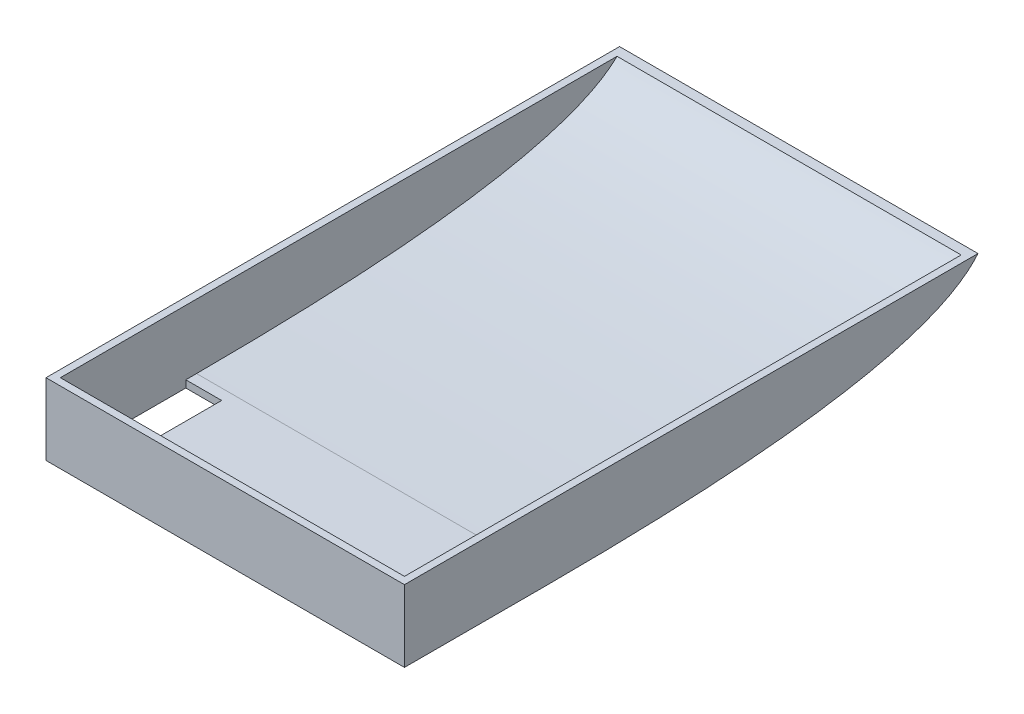
ISO-10303-21;
HEADER;
FILE_DESCRIPTION(('STEP AP214'),'2;1');
FILE_NAME('part.step','',(''),(''),'','','');
FILE_SCHEMA(('AUTOMOTIVE_DESIGN { 1 0 10303 214 1 1 1 1 }'));
ENDSEC;
DATA;
#1=APPLICATION_CONTEXT('core data for automotive mechanical design processes');
#2=APPLICATION_PROTOCOL_DEFINITION('international standard','automotive_design',2000,#1);
#3=PRODUCT_CONTEXT('',#1,'mechanical');
#4=PRODUCT('Part','Part','',(#3));
#5=PRODUCT_RELATED_PRODUCT_CATEGORY('part','',(#4));
#6=PRODUCT_DEFINITION_FORMATION('','',#4);
#7=PRODUCT_DEFINITION_CONTEXT('part definition',#1,'design');
#8=PRODUCT_DEFINITION('design','',#6,#7);
#9=PRODUCT_DEFINITION_SHAPE('','',#8);
#10=(LENGTH_UNIT() NAMED_UNIT(*) SI_UNIT(.MILLI.,.METRE.));
#11=(NAMED_UNIT(*) PLANE_ANGLE_UNIT() SI_UNIT($,.RADIAN.));
#12=(NAMED_UNIT(*) SI_UNIT($,.STERADIAN.) SOLID_ANGLE_UNIT());
#13=UNCERTAINTY_MEASURE_WITH_UNIT(LENGTH_MEASURE(1.E-05),#10,'distance_accuracy_value','');
#14=(GEOMETRIC_REPRESENTATION_CONTEXT(3) GLOBAL_UNCERTAINTY_ASSIGNED_CONTEXT((#13)) GLOBAL_UNIT_ASSIGNED_CONTEXT((#10,
#11,#12)) REPRESENTATION_CONTEXT('',''));
#15=CARTESIAN_POINT('',(0.,0.,0.));
#16=DIRECTION('',(0.,0.,1.));
#17=DIRECTION('',(1.,0.,0.));
#18=AXIS2_PLACEMENT_3D('',#15,#16,#17);
#19=CARTESIAN_POINT('',(63.5,25.4,50.8));
#20=DIRECTION('',(0.,-1.,0.));
#21=DIRECTION('',(0.,0.,-1.));
#22=AXIS2_PLACEMENT_3D('',#19,#20,#21);
#23=PLANE('',#22);
#24=DIRECTION('',(0.,0.,1.));
#25=VECTOR('',#24,1.);
#26=CARTESIAN_POINT('',(-63.5,25.4,50.8));
#27=LINE('',#26,#25);
#28=CARTESIAN_POINT('',(-63.5,25.4,-152.4));
#29=VERTEX_POINT('',#28);
#30=CARTESIAN_POINT('',(-63.5,25.4,50.8));
#31=VERTEX_POINT('',#30);
#32=EDGE_CURVE('E248',#29,#31,#27,.T.);
#33=ORIENTED_EDGE('',*,*,#32,.T.);
#34=DIRECTION('',(-1.,0.,0.));
#35=VECTOR('',#34,1.);
#36=CARTESIAN_POINT('',(63.5,25.4,50.8));
#37=LINE('',#36,#35);
#38=CARTESIAN_POINT('',(63.5,25.4,50.8));
#39=VERTEX_POINT('',#38);
#40=EDGE_CURVE('E270',#39,#31,#37,.T.);
#41=ORIENTED_EDGE('',*,*,#40,.F.);
#42=DIRECTION('',(0.,0.,1.));
#43=VECTOR('',#42,1.);
#44=CARTESIAN_POINT('',(63.5,25.4,50.8));
#45=LINE('',#44,#43);
#46=CARTESIAN_POINT('',(63.5,25.4,-152.4));
#47=VERTEX_POINT('',#46);
#48=EDGE_CURVE('E241',#47,#39,#45,.T.);
#49=ORIENTED_EDGE('',*,*,#48,.F.);
#50=DIRECTION('',(-1.,0.,0.));
#51=VECTOR('',#50,1.);
#52=CARTESIAN_POINT('',(63.5,25.4,-152.4));
#53=LINE('',#52,#51);
#54=EDGE_CURVE('E183',#47,#29,#53,.T.);
#55=ORIENTED_EDGE('',*,*,#54,.T.);
#56=EDGE_LOOP('',(#33,#41,#49,#55));
#57=FACE_BOUND('',#56,.T.);
#58=DIRECTION('',(0.,0.,1.));
#59=VECTOR('',#58,1.);
#60=CARTESIAN_POINT('',(-60.96,25.4,-105.027078163945));
#61=LINE('',#60,#59);
#62=CARTESIAN_POINT('',(-60.96,25.4,-148.966075695826));
#63=VERTEX_POINT('',#62);
#64=CARTESIAN_POINT('',(-60.96,25.4,48.26));
#65=VERTEX_POINT('',#64);
#66=EDGE_CURVE('E177',#63,#65,#61,.T.);
#67=ORIENTED_EDGE('',*,*,#66,.F.);
#68=DIRECTION('',(-1.,0.,0.));
#69=VECTOR('',#68,1.);
#70=CARTESIAN_POINT('',(60.96,25.4,-148.966075695826));
#71=LINE('',#70,#69);
#72=CARTESIAN_POINT('',(60.96,25.4,-148.966075695826));
#73=VERTEX_POINT('',#72);
#74=EDGE_CURVE('E285',#73,#63,#71,.T.);
#75=ORIENTED_EDGE('',*,*,#74,.F.);
#76=DIRECTION('',(0.,0.,1.));
#77=VECTOR('',#76,1.);
#78=CARTESIAN_POINT('',(60.96,25.4,-105.027078163945));
#79=LINE('',#78,#77);
#80=CARTESIAN_POINT('',(60.96,25.4,48.26));
#81=VERTEX_POINT('',#80);
#82=EDGE_CURVE('E286',#73,#81,#79,.T.);
#83=ORIENTED_EDGE('',*,*,#82,.T.);
#84=DIRECTION('',(-1.,0.,0.));
#85=VECTOR('',#84,1.);
#86=CARTESIAN_POINT('',(63.5,25.4,48.26));
#87=LINE('',#86,#85);
#88=EDGE_CURVE('E252',#81,#65,#87,.T.);
#89=ORIENTED_EDGE('',*,*,#88,.T.);
#90=EDGE_LOOP('',(#67,#75,#83,#89));
#91=FACE_BOUND('',#90,.T.);
#92=ADVANCED_FACE('F33',(#57,#91),#23,.F.);
#93=CARTESIAN_POINT('',(63.5,25.4,50.8));
#94=DIRECTION('',(0.,0.,-1.));
#95=DIRECTION('',(-1.,0.,0.));
#96=AXIS2_PLACEMENT_3D('',#93,#94,#95);
#97=PLANE('',#96);
#98=DIRECTION('',(0.,-1.,0.));
#99=VECTOR('',#98,1.);
#100=CARTESIAN_POINT('',(-63.5,25.4,50.8));
#101=LINE('',#100,#99);
#102=CARTESIAN_POINT('',(-63.5,0.,50.8));
#103=VERTEX_POINT('',#102);
#104=EDGE_CURVE('E251',#31,#103,#101,.T.);
#105=ORIENTED_EDGE('',*,*,#104,.T.);
#106=DIRECTION('',(-1.,0.,0.));
#107=VECTOR('',#106,1.);
#108=CARTESIAN_POINT('',(63.5,0.,50.8));
#109=LINE('',#108,#107);
#110=CARTESIAN_POINT('',(63.5,0.,50.8));
#111=VERTEX_POINT('',#110);
#112=EDGE_CURVE('E267',#111,#103,#109,.T.);
#113=ORIENTED_EDGE('',*,*,#112,.F.);
#114=DIRECTION('',(0.,-1.,0.));
#115=VECTOR('',#114,1.);
#116=CARTESIAN_POINT('',(63.5,25.4,50.8));
#117=LINE('',#116,#115);
#118=EDGE_CURVE('E244',#39,#111,#117,.T.);
#119=ORIENTED_EDGE('',*,*,#118,.F.);
#120=ORIENTED_EDGE('',*,*,#40,.T.);
#121=EDGE_LOOP('',(#105,#113,#119,#120));
#122=FACE_BOUND('',#121,.T.);
#123=ADVANCED_FACE('F326',(#122),#97,.F.);
#124=CARTESIAN_POINT('',(63.5,0.,50.8));
#125=DIRECTION('',(0.,1.,0.));
#126=DIRECTION('',(0.,0.,1.));
#127=AXIS2_PLACEMENT_3D('',#124,#125,#126);
#128=PLANE('',#127);
#129=DIRECTION('',(1.,0.,0.));
#130=VECTOR('',#129,1.);
#131=CARTESIAN_POINT('',(63.5,0.,48.26));
#132=LINE('',#131,#130);
#133=CARTESIAN_POINT('',(48.26,0.,48.26));
#134=VERTEX_POINT('',#133);
#135=CARTESIAN_POINT('',(60.96,0.,48.26));
#136=VERTEX_POINT('',#135);
#137=EDGE_CURVE('E134',#134,#136,#132,.T.);
#138=ORIENTED_EDGE('',*,*,#137,.T.);
#139=DIRECTION('',(0.,0.,-1.));
#140=VECTOR('',#139,1.);
#141=CARTESIAN_POINT('',(60.96,0.,50.8));
#142=LINE('',#141,#140);
#143=CARTESIAN_POINT('',(60.96,0.,3.81));
#144=VERTEX_POINT('',#143);
#145=EDGE_CURVE('E142',#136,#144,#142,.T.);
#146=ORIENTED_EDGE('',*,*,#145,.T.);
#147=DIRECTION('',(-1.,0.,0.));
#148=VECTOR('',#147,1.);
#149=CARTESIAN_POINT('',(63.5,0.,3.81));
#150=LINE('',#149,#148);
#151=CARTESIAN_POINT('',(48.26,0.,3.81));
#152=VERTEX_POINT('',#151);
#153=EDGE_CURVE('E129',#144,#152,#150,.T.);
#154=ORIENTED_EDGE('',*,*,#153,.T.);
#155=DIRECTION('',(0.,0.,1.));
#156=VECTOR('',#155,1.);
#157=CARTESIAN_POINT('',(48.26,0.,50.8));
#158=LINE('',#157,#156);
#159=EDGE_CURVE('E150',#152,#134,#158,.T.);
#160=ORIENTED_EDGE('',*,*,#159,.T.);
#161=EDGE_LOOP('',(#138,#146,#154,#160));
#162=FACE_BOUND('',#161,.T.);
#163=DIRECTION('',(-1.,0.,0.));
#164=VECTOR('',#163,1.);
#165=CARTESIAN_POINT('',(63.5,0.,3.81));
#166=LINE('',#165,#164);
#167=CARTESIAN_POINT('',(-48.26,0.,3.81));
#168=VERTEX_POINT('',#167);
#169=CARTESIAN_POINT('',(-60.96,0.,3.81));
#170=VERTEX_POINT('',#169);
#171=EDGE_CURVE('E168',#168,#170,#166,.T.);
#172=ORIENTED_EDGE('',*,*,#171,.T.);
#173=DIRECTION('',(0.,0.,1.));
#174=VECTOR('',#173,1.);
#175=CARTESIAN_POINT('',(-60.96,0.,50.8));
#176=LINE('',#175,#174);
#177=CARTESIAN_POINT('',(-60.96,0.,48.26));
#178=VERTEX_POINT('',#177);
#179=EDGE_CURVE('E174',#170,#178,#176,.T.);
#180=ORIENTED_EDGE('',*,*,#179,.T.);
#181=DIRECTION('',(1.,0.,0.));
#182=VECTOR('',#181,1.);
#183=CARTESIAN_POINT('',(63.5,0.,48.26));
#184=LINE('',#183,#182);
#185=CARTESIAN_POINT('',(-48.26,0.,48.26));
#186=VERTEX_POINT('',#185);
#187=EDGE_CURVE('E161',#178,#186,#184,.T.);
#188=ORIENTED_EDGE('',*,*,#187,.T.);
#189=DIRECTION('',(0.,0.,-1.));
#190=VECTOR('',#189,1.);
#191=CARTESIAN_POINT('',(-48.26,0.,50.8));
#192=LINE('',#191,#190);
#193=EDGE_CURVE('E171',#186,#168,#192,.T.);
#194=ORIENTED_EDGE('',*,*,#193,.T.);
#195=EDGE_LOOP('',(#172,#180,#188,#194));
#196=FACE_BOUND('',#195,.T.);
#197=DIRECTION('',(0.,0.,-1.));
#198=VECTOR('',#197,1.);
#199=CARTESIAN_POINT('',(-63.5,0.,50.8));
#200=LINE('',#199,#198);
#201=CARTESIAN_POINT('',(-63.5,0.,0.));
#202=VERTEX_POINT('',#201);
#203=EDGE_CURVE('E254',#103,#202,#200,.T.);
#204=ORIENTED_EDGE('',*,*,#203,.T.);
#205=DIRECTION('',(-1.,0.,0.));
#206=VECTOR('',#205,1.);
#207=CARTESIAN_POINT('',(63.5,0.,0.));
#208=LINE('',#207,#206);
#209=CARTESIAN_POINT('',(63.5,0.,0.));
#210=VERTEX_POINT('',#209);
#211=EDGE_CURVE('E264',#210,#202,#208,.T.);
#212=ORIENTED_EDGE('',*,*,#211,.F.);
#213=DIRECTION('',(0.,0.,-1.));
#214=VECTOR('',#213,1.);
#215=CARTESIAN_POINT('',(63.5,0.,50.8));
#216=LINE('',#215,#214);
#217=EDGE_CURVE('E184',#111,#210,#216,.T.);
#218=ORIENTED_EDGE('',*,*,#217,.F.);
#219=ORIENTED_EDGE('',*,*,#112,.T.);
#220=EDGE_LOOP('',(#204,#212,#218,#219));
#221=FACE_BOUND('',#220,.T.);
#222=ADVANCED_FACE('F147',(#162,#196,#221),#128,.F.);
#223=CARTESIAN_POINT('',(63.5,0.,0.));
#224=CARTESIAN_POINT('',(63.5,0.12852682136491,-90.3999097623102));
#225=CARTESIAN_POINT('',(63.5,8.8622905893951,-138.872298674878));
#226=CARTESIAN_POINT('',(63.5,25.4,-152.4));
#227=B_SPLINE_CURVE_WITH_KNOTS('',3,(#223,#224,#225,#226),.UNSPECIFIED.,.F.,.F.,(4,4),(0.,1.),.UNSPECIFIED.);
#228=DIRECTION('',(-1.,0.,0.));
#229=VECTOR('',#228,1.);
#230=SURFACE_OF_LINEAR_EXTRUSION('',#227,#229);
#231=CARTESIAN_POINT('',(-63.5,0.,0.));
#232=CARTESIAN_POINT('',(-63.5,0.12852682136491,-90.3999097623102));
#233=CARTESIAN_POINT('',(-63.5,8.8622905893951,-138.872298674878));
#234=CARTESIAN_POINT('',(-63.5,25.4,-152.4));
#235=B_SPLINE_CURVE_WITH_KNOTS('',3,(#231,#232,#233,#234),.UNSPECIFIED.,.F.,.F.,(4,4),(0.,1.),.UNSPECIFIED.);
#236=EDGE_CURVE('E245',#202,#29,#235,.T.);
#237=ORIENTED_EDGE('',*,*,#236,.T.);
#238=ORIENTED_EDGE('',*,*,#54,.F.);
#239=EDGE_CURVE('E178',#210,#47,#227,.T.);
#240=ORIENTED_EDGE('',*,*,#239,.F.);
#241=ORIENTED_EDGE('',*,*,#211,.T.);
#242=EDGE_LOOP('',(#237,#238,#240,#241));
#243=FACE_BOUND('',#242,.T.);
#244=ADVANCED_FACE('F191',(#243),#230,.F.);
#245=CARTESIAN_POINT('',(63.5,6.546556529035,-105.027078163945));
#246=DIRECTION('',(-1.,0.,0.));
#247=DIRECTION('',(0.,0.,1.));
#248=AXIS2_PLACEMENT_3D('',#245,#246,#247);
#249=PLANE('',#248);
#250=ORIENTED_EDGE('',*,*,#48,.T.);
#251=ORIENTED_EDGE('',*,*,#118,.T.);
#252=ORIENTED_EDGE('',*,*,#217,.T.);
#253=ORIENTED_EDGE('',*,*,#239,.T.);
#254=EDGE_LOOP('',(#250,#251,#252,#253));
#255=FACE_BOUND('',#254,.T.);
#256=ADVANCED_FACE('F196',(#255),#249,.F.);
#257=CARTESIAN_POINT('',(-63.5,6.546556529035,-105.027078163945));
#258=DIRECTION('',(-1.,0.,0.));
#259=DIRECTION('',(0.,0.,1.));
#260=AXIS2_PLACEMENT_3D('',#257,#258,#259);
#261=PLANE('',#260);
#262=ORIENTED_EDGE('',*,*,#32,.F.);
#263=ORIENTED_EDGE('',*,*,#236,.F.);
#264=ORIENTED_EDGE('',*,*,#203,.F.);
#265=ORIENTED_EDGE('',*,*,#104,.F.);
#266=EDGE_LOOP('',(#262,#263,#264,#265));
#267=FACE_BOUND('',#266,.T.);
#268=ADVANCED_FACE('F337',(#267),#261,.T.);
#269=CARTESIAN_POINT('',(63.5,25.4,48.26));
#270=DIRECTION('',(0.,0.,-1.));
#271=DIRECTION('',(-1.,0.,0.));
#272=AXIS2_PLACEMENT_3D('',#269,#270,#271);
#273=PLANE('',#272);
#274=DIRECTION('',(0.,-1.,0.));
#275=VECTOR('',#274,1.);
#276=CARTESIAN_POINT('',(-60.96,6.546556529035,48.26));
#277=LINE('',#276,#275);
#278=EDGE_CURVE('E185',#65,#178,#277,.T.);
#279=ORIENTED_EDGE('',*,*,#278,.F.);
#280=ORIENTED_EDGE('',*,*,#88,.F.);
#281=DIRECTION('',(0.,-1.,0.));
#282=VECTOR('',#281,1.);
#283=CARTESIAN_POINT('',(60.96,6.546556529035,48.26));
#284=LINE('',#283,#282);
#285=EDGE_CURVE('E280',#81,#136,#284,.T.);
#286=ORIENTED_EDGE('',*,*,#285,.T.);
#287=ORIENTED_EDGE('',*,*,#137,.F.);
#288=DIRECTION('',(0.,1.,0.));
#289=VECTOR('',#288,1.);
#290=CARTESIAN_POINT('',(48.26,-1.32274244273125,48.26));
#291=LINE('',#290,#289);
#292=CARTESIAN_POINT('',(48.26,2.54,48.26));
#293=VERTEX_POINT('',#292);
#294=EDGE_CURVE('E315',#134,#293,#291,.T.);
#295=ORIENTED_EDGE('',*,*,#294,.T.);
#296=DIRECTION('',(-1.,0.,0.));
#297=VECTOR('',#296,1.);
#298=CARTESIAN_POINT('',(63.5,2.54,48.26));
#299=LINE('',#298,#297);
#300=CARTESIAN_POINT('',(-48.26,2.54,48.26));
#301=VERTEX_POINT('',#300);
#302=EDGE_CURVE('E291',#293,#301,#299,.T.);
#303=ORIENTED_EDGE('',*,*,#302,.T.);
#304=DIRECTION('',(0.,1.,0.));
#305=VECTOR('',#304,1.);
#306=CARTESIAN_POINT('',(-48.26,-1.32274244273125,48.26));
#307=LINE('',#306,#305);
#308=EDGE_CURVE('E149',#186,#301,#307,.T.);
#309=ORIENTED_EDGE('',*,*,#308,.F.);
#310=ORIENTED_EDGE('',*,*,#187,.F.);
#311=EDGE_LOOP('',(#279,#280,#286,#287,#295,#303,#309,#310));
#312=FACE_BOUND('',#311,.T.);
#313=ADVANCED_FACE('F234',(#312),#273,.T.);
#314=CARTESIAN_POINT('',(63.5,2.54,50.8));
#315=DIRECTION('',(0.,1.,0.));
#316=DIRECTION('',(0.,0.,1.));
#317=AXIS2_PLACEMENT_3D('',#314,#315,#316);
#318=PLANE('',#317);
#319=DIRECTION('',(0.,0.,1.));
#320=VECTOR('',#319,1.);
#321=CARTESIAN_POINT('',(48.26,2.54,50.8));
#322=LINE('',#321,#320);
#323=CARTESIAN_POINT('',(48.26,2.54,3.81));
#324=VERTEX_POINT('',#323);
#325=EDGE_CURVE('E11',#324,#293,#322,.T.);
#326=ORIENTED_EDGE('',*,*,#325,.F.);
#327=DIRECTION('',(-1.,0.,0.));
#328=VECTOR('',#327,1.);
#329=CARTESIAN_POINT('',(63.5,2.54,3.81));
#330=LINE('',#329,#328);
#331=CARTESIAN_POINT('',(60.96,2.54,3.81000000000001));
#332=VERTEX_POINT('',#331);
#333=EDGE_CURVE('E135',#332,#324,#330,.T.);
#334=ORIENTED_EDGE('',*,*,#333,.F.);
#335=DIRECTION('',(0.,0.,-1.));
#336=VECTOR('',#335,1.);
#337=CARTESIAN_POINT('',(60.96,2.54,-105.027078163945));
#338=LINE('',#337,#336);
#339=CARTESIAN_POINT('',(60.96,2.54,0.00180644331960574));
#340=VERTEX_POINT('',#339);
#341=EDGE_CURVE('E145',#332,#340,#338,.T.);
#342=ORIENTED_EDGE('',*,*,#341,.T.);
#343=CARTESIAN_POINT('',(-60.96,2.53999743283016,0.00361126241358388));
#344=CARTESIAN_POINT('',(-55.88,2.53999743283016,0.00361126241358388));
#345=CARTESIAN_POINT('',(-50.8,2.53999743283016,0.00361126241358388));
#346=CARTESIAN_POINT('',(-40.64,2.53999743283016,0.00361126241358388));
#347=CARTESIAN_POINT('',(-35.56,2.53999743283016,0.00361126241358388));
#348=CARTESIAN_POINT('',(-25.4,2.53999743283016,0.00361126241358388));
#349=CARTESIAN_POINT('',(-20.32,2.53999743283016,0.00361126241358388));
#350=CARTESIAN_POINT('',(-10.16,2.53999743283016,0.00361126241358388));
#351=CARTESIAN_POINT('',(-5.08,2.53999743283016,0.00361126241358388));
#352=CARTESIAN_POINT('',(5.08,2.53999743283016,0.00361126241358388));
#353=CARTESIAN_POINT('',(10.16,2.53999743283016,0.00361126241358388));
#354=CARTESIAN_POINT('',(20.32,2.53999743283016,0.00361126241358388));
#355=CARTESIAN_POINT('',(25.4,2.53999743283016,0.00361126241358388));
#356=CARTESIAN_POINT('',(35.56,2.53999743283016,0.00361126241358388));
#357=CARTESIAN_POINT('',(40.64,2.53999743283016,0.00361126241358388));
#358=CARTESIAN_POINT('',(50.8,2.53999743283016,0.00361126241358388));
#359=CARTESIAN_POINT('',(55.88,2.53999743283016,0.00361126241358388));
#360=CARTESIAN_POINT('',(60.96,2.53999743283016,0.00361126241358388));
#361=B_SPLINE_CURVE_WITH_KNOTS('',3,(#343,#344,#345,#346,#347,#348,#349,#350,#351,#352,#353,
#354,#355,#356,#357,#358,#359,#360),.UNSPECIFIED.,.F.,.F.,(4,2,2,2,2,2,2,2,4),(0.,15.24,30.48,
45.72,60.96,76.2,91.44,106.68,121.92),.UNSPECIFIED.);
#362=CARTESIAN_POINT('',(-60.96,2.54,0.00180644331960574));
#363=VERTEX_POINT('',#362);
#364=EDGE_CURVE('E293',#340,#363,#361,.F.);
#365=ORIENTED_EDGE('',*,*,#364,.T.);
#366=DIRECTION('',(0.,0.,-1.));
#367=VECTOR('',#366,1.);
#368=CARTESIAN_POINT('',(-60.96,2.54,-105.027078163945));
#369=LINE('',#368,#367);
#370=CARTESIAN_POINT('',(-60.96,2.54,3.81));
#371=VERTEX_POINT('',#370);
#372=EDGE_CURVE('E273',#371,#363,#369,.T.);
#373=ORIENTED_EDGE('',*,*,#372,.F.);
#374=DIRECTION('',(-1.,0.,0.));
#375=VECTOR('',#374,1.);
#376=CARTESIAN_POINT('',(63.5,2.54,3.81));
#377=LINE('',#376,#375);
#378=CARTESIAN_POINT('',(-48.26,2.54,3.81));
#379=VERTEX_POINT('',#378);
#380=EDGE_CURVE('E166',#379,#371,#377,.T.);
#381=ORIENTED_EDGE('',*,*,#380,.F.);
#382=DIRECTION('',(0.,0.,-1.));
#383=VECTOR('',#382,1.);
#384=CARTESIAN_POINT('',(-48.26,2.54,50.8));
#385=LINE('',#384,#383);
#386=EDGE_CURVE('E40',#301,#379,#385,.T.);
#387=ORIENTED_EDGE('',*,*,#386,.F.);
#388=ORIENTED_EDGE('',*,*,#302,.F.);
#389=EDGE_LOOP('',(#326,#334,#342,#365,#373,#381,#387,#388));
#390=FACE_BOUND('',#389,.T.);
#391=ADVANCED_FACE('F204',(#390),#318,.T.);
#392=CARTESIAN_POINT('',(63.5,0.,0.));
#393=CARTESIAN_POINT('',(63.5,0.12852682136491,-90.3999097623102));
#394=CARTESIAN_POINT('',(63.5,8.8622905893951,-138.872298674878));
#395=CARTESIAN_POINT('',(63.5,25.4,-152.4));
#396=B_SPLINE_CURVE_WITH_KNOTS('',3,(#392,#393,#394,#395),.UNSPECIFIED.,.F.,.F.,(4,4),(0.,1.),.UNSPECIFIED.);
#397=DIRECTION('',(-1.,0.,0.));
#398=VECTOR('',#397,1.);
#399=SURFACE_OF_LINEAR_EXTRUSION('',#396,#398);
#400=OFFSET_SURFACE('',#399,2.54,.F.);
#401=CARTESIAN_POINT('',(-60.96,2.54,0.00180644331960574));
#402=CARTESIAN_POINT('',(-60.96,2.54296159949105,-2.07123882373989));
#403=CARTESIAN_POINT('',(-60.96,2.5504656227912,-4.14428086822597));
#404=CARTESIAN_POINT('',(-60.96,2.57520699127266,-8.29095142177547));
#405=CARTESIAN_POINT('',(-60.96,2.59244736425697,-10.3645799126167));
#406=CARTESIAN_POINT('',(-60.96,2.63731404707515,-14.5122050272702));
#407=CARTESIAN_POINT('',(-60.96,2.66494275457469,-16.5862016255024));
#408=CARTESIAN_POINT('',(-60.96,2.73132893822943,-20.7343410385875));
#409=CARTESIAN_POINT('',(-60.96,2.77008814666917,-22.8084838259182));
#410=CARTESIAN_POINT('',(-60.96,2.85955862977798,-26.9566930534272));
#411=CARTESIAN_POINT('',(-60.96,2.91027093949728,-29.0307594714279));
#412=CARTESIAN_POINT('',(-60.96,3.02457226341336,-33.1785917306156));
#413=CARTESIAN_POINT('',(-60.96,3.08816160157526,-35.2523575629265));
#414=CARTESIAN_POINT('',(-60.96,3.22906590748395,-39.3936573069112));
#415=CARTESIAN_POINT('',(-60.96,3.30634225175279,-41.4611925259151));
#416=CARTESIAN_POINT('',(-60.96,3.47591453691312,-45.5955443898263));
#417=CARTESIAN_POINT('',(-60.96,3.56820971145094,-47.6623610660083));
#418=CARTESIAN_POINT('',(-60.96,3.76916512221427,-51.7950531948383));
#419=CARTESIAN_POINT('',(-60.96,3.87782417888787,-53.8609287045712));
#420=CARTESIAN_POINT('',(-60.96,4.11305901793069,-57.99150474508));
#421=CARTESIAN_POINT('',(-60.96,4.23963341841402,-60.0562053541599));
#422=CARTESIAN_POINT('',(-60.96,4.51250576217388,-64.1841823096239));
#423=CARTESIAN_POINT('',(-60.96,4.65880250737594,-66.2474587348765));
#424=CARTESIAN_POINT('',(-60.96,4.97324068859085,-70.3723261736285));
#425=CARTESIAN_POINT('',(-60.96,5.14138179112592,-72.4339172123736));
#426=CARTESIAN_POINT('',(-60.96,5.45961165274293,-76.0702464573845));
#427=CARTESIAN_POINT('',(-60.96,5.60464243137306,-77.6454275339102));
#428=CARTESIAN_POINT('',(-60.96,5.91028111493583,-80.7942893081196));
#429=CARTESIAN_POINT('',(-60.96,6.07088907514622,-82.3679700004589));
#430=CARTESIAN_POINT('',(-60.96,6.40921561441031,-85.5135974410036));
#431=CARTESIAN_POINT('',(-60.96,6.58693527504796,-87.0855440732436));
#432=CARTESIAN_POINT('',(-60.96,6.96125632651177,-90.2271895013959));
#433=CARTESIAN_POINT('',(-60.96,7.15785764414895,-91.7968883059973));
#434=CARTESIAN_POINT('',(-60.96,7.57277946241516,-94.9391373552935));
#435=CARTESIAN_POINT('',(-60.96,7.79117515492551,-96.5116777080353));
#436=CARTESIAN_POINT('',(-60.96,8.25162017458668,-99.6533319362776));
#437=CARTESIAN_POINT('',(-60.96,8.49366986260122,-101.22244575913));
#438=CARTESIAN_POINT('',(-60.96,9.00444553941206,-104.356245032354));
#439=CARTESIAN_POINT('',(-60.96,9.27316995009256,-105.920930739073));
#440=CARTESIAN_POINT('',(-60.96,9.84099788072674,-109.04474883871));
#441=CARTESIAN_POINT('',(-60.96,10.1400999197198,-110.603881498516));
#442=CARTESIAN_POINT('',(-60.96,10.6148985096487,-112.936657134971));
#443=CARTESIAN_POINT('',(-60.96,10.7774594428824,-113.712985001757));
#444=CARTESIAN_POINT('',(-60.96,11.1120222572797,-115.26360823273));
#445=CARTESIAN_POINT('',(-60.96,11.2840241214188,-116.037903600579));
#446=CARTESIAN_POINT('',(-60.96,11.6382281721756,-117.584126234269));
#447=CARTESIAN_POINT('',(-60.96,11.8204299243408,-118.356053599498));
#448=CARTESIAN_POINT('',(-60.96,12.1959092484627,-119.897182050894));
#449=CARTESIAN_POINT('',(-60.96,12.3891863738777,-120.66638324565));
#450=CARTESIAN_POINT('',(-60.96,12.7878248399464,-122.201669160383));
#451=CARTESIAN_POINT('',(-60.96,12.9931864008888,-122.967753823275));
#452=CARTESIAN_POINT('',(-60.96,13.415559334188,-124.490574539077));
#453=CARTESIAN_POINT('',(-60.96,13.6324726344681,-125.247337735917));
#454=CARTESIAN_POINT('',(-60.96,14.080632289911,-126.756646166046));
#455=CARTESIAN_POINT('',(-60.96,14.3118791336611,-127.509191254598));
#456=CARTESIAN_POINT('',(-60.96,14.7902162240528,-129.009290141407));
#457=CARTESIAN_POINT('',(-60.96,15.0373073619954,-129.756843656254));
#458=CARTESIAN_POINT('',(-60.96,15.5491372884443,-131.24608572261));
#459=CARTESIAN_POINT('',(-60.96,15.813879994145,-131.987772931158));
#460=CARTESIAN_POINT('',(-60.96,16.3632030239682,-133.464302903546));
#461=CARTESIAN_POINT('',(-60.96,16.6477950505067,-134.199141335233));
#462=CARTESIAN_POINT('',(-60.96,17.1482255680172,-135.435269485734));
#463=CARTESIAN_POINT('',(-60.96,17.3582977350831,-135.93889581005));
#464=CARTESIAN_POINT('',(-60.96,17.7900294836349,-136.941152232485));
#465=CARTESIAN_POINT('',(-60.96,18.0116887048341,-137.439782485378));
#466=CARTESIAN_POINT('',(-60.96,18.4675409397188,-138.430929177427));
#467=CARTESIAN_POINT('',(-60.96,18.7017263271212,-138.923449116658));
#468=CARTESIAN_POINT('',(-60.96,19.1837458086147,-139.901184436573));
#469=CARTESIAN_POINT('',(-60.96,19.4315663448378,-140.386406483481));
#470=CARTESIAN_POINT('',(-60.96,19.9421787850147,-141.348254483612));
#471=CARTESIAN_POINT('',(-60.96,20.2049541280502,-141.824889204657));
#472=CARTESIAN_POINT('',(-60.96,20.7512873016356,-142.775478035945));
#473=CARTESIAN_POINT('',(-60.96,21.0350938489522,-143.249289748635));
#474=CARTESIAN_POINT('',(-60.96,21.6218860936338,-144.18497737232));
#475=CARTESIAN_POINT('',(-60.96,21.9248734717742,-144.646852232306));
#476=CARTESIAN_POINT('',(-60.96,22.5525275518085,-145.556613216821));
#477=CARTESIAN_POINT('',(-60.96,22.8772214541115,-146.004480717283));
#478=CARTESIAN_POINT('',(-60.96,23.3825165460705,-146.663441933554));
#479=CARTESIAN_POINT('',(-60.96,23.554304440917,-146.881322269135));
#480=CARTESIAN_POINT('',(-60.96,23.9041286113822,-147.312001695411));
#481=CARTESIAN_POINT('',(-60.96,24.0821645540741,-147.524801055832));
#482=CARTESIAN_POINT('',(-60.96,24.4460239682666,-147.946164878619));
#483=CARTESIAN_POINT('',(-60.96,24.6318919523061,-148.154690982494));
#484=CARTESIAN_POINT('',(-60.96,25.0106265228138,-148.565357927499));
#485=CARTESIAN_POINT('',(-60.96,25.2034944748256,-148.767497508213));
#486=CARTESIAN_POINT('',(-60.96,25.4,-148.966075695826));
#487=B_SPLINE_CURVE_WITH_KNOTS('',3,(#401,#402,#403,#404,#405,#406,#407,#408,#409,#410,#411,
#412,#413,#414,#415,#416,#417,#418,#419,#420,#421,#422,#423,#424,#425,#426,#427,#428,#429,#430,
#431,#432,#433,#434,#435,#436,#437,#438,#439,#440,#441,#442,#443,#444,#445,#446,#447,#448,#449,
#450,#451,#452,#453,#454,#455,#456,#457,#458,#459,#460,#461,#462,#463,#464,#465,#466,#467,#468,
#469,#470,#471,#472,#473,#474,#475,#476,#477,#478,#479,#480,#481,#482,#483,#484,#485,#486),
.UNSPECIFIED.,.F.,.F.,(4,2,2,2,2,2,2,2,2,2,2,2,2,2,2,2,2,2,2,2,2,2,2,2,2,2,2,2,2,2,2,2,2,2,2,2,
2,2,2,2,2,2,4),(0.,6.21914199851044,12.4402190871462,18.6627329054322,24.8862156838635,
31.1102375680172,37.3344160579135,43.5413024793427,49.7478722862771,55.9539949211929,
62.1596391123545,68.3649064985954,74.5700791658376,79.3155424071164,84.0610224889299,
88.8068027167542,93.5525645497517,98.3153061464414,103.078120414534,107.840653075282,
112.602953665878,114.982401378112,117.361844799678,119.741186948604,122.120433233546,
124.499722903478,126.86130580811,129.22296925632,131.584765673703,133.947087971175,
136.310814974163,137.94773860292,139.584611363585,141.22049864887,142.854787725059,
144.48730093758,146.14381175975,147.8004679399,149.459240462684,150.29151817721,
151.123751610999,151.961611663528,152.799636052507),.UNSPECIFIED.);
#488=EDGE_CURVE('E223',#363,#63,#487,.T.);
#489=ORIENTED_EDGE('',*,*,#488,.F.);
#490=ORIENTED_EDGE('',*,*,#364,.F.);
#491=CARTESIAN_POINT('',(60.96,2.54,0.00180644331960574));
#492=CARTESIAN_POINT('',(60.96,2.54296159949105,-2.07123882373989));
#493=CARTESIAN_POINT('',(60.96,2.5504656227912,-4.14428086822597));
#494=CARTESIAN_POINT('',(60.96,2.57520699127266,-8.29095142177547));
#495=CARTESIAN_POINT('',(60.96,2.59244736425697,-10.3645799126167));
#496=CARTESIAN_POINT('',(60.96,2.63731404707515,-14.5122050272702));
#497=CARTESIAN_POINT('',(60.96,2.66494275457469,-16.5862016255024));
#498=CARTESIAN_POINT('',(60.96,2.73132893822943,-20.7343410385875));
#499=CARTESIAN_POINT('',(60.96,2.77008814666917,-22.8084838259182));
#500=CARTESIAN_POINT('',(60.96,2.85955862977798,-26.9566930534272));
#501=CARTESIAN_POINT('',(60.96,2.91027093949728,-29.0307594714279));
#502=CARTESIAN_POINT('',(60.96,3.02457226341336,-33.1785917306156));
#503=CARTESIAN_POINT('',(60.96,3.08816160157526,-35.2523575629265));
#504=CARTESIAN_POINT('',(60.96,3.22906590748395,-39.3936573069112));
#505=CARTESIAN_POINT('',(60.96,3.30634225175279,-41.4611925259151));
#506=CARTESIAN_POINT('',(60.96,3.47591453691312,-45.5955443898263));
#507=CARTESIAN_POINT('',(60.96,3.56820971145094,-47.6623610660083));
#508=CARTESIAN_POINT('',(60.96,3.76916512221427,-51.7950531948383));
#509=CARTESIAN_POINT('',(60.96,3.87782417888787,-53.8609287045712));
#510=CARTESIAN_POINT('',(60.96,4.11305901793069,-57.99150474508));
#511=CARTESIAN_POINT('',(60.96,4.23963341841402,-60.0562053541599));
#512=CARTESIAN_POINT('',(60.96,4.51250576217388,-64.1841823096239));
#513=CARTESIAN_POINT('',(60.96,4.65880250737594,-66.2474587348765));
#514=CARTESIAN_POINT('',(60.96,4.97324068859085,-70.3723261736285));
#515=CARTESIAN_POINT('',(60.96,5.14138179112592,-72.4339172123736));
#516=CARTESIAN_POINT('',(60.96,5.45961165274293,-76.0702464573845));
#517=CARTESIAN_POINT('',(60.96,5.60464243137306,-77.6454275339102));
#518=CARTESIAN_POINT('',(60.96,5.91028111493583,-80.7942893081196));
#519=CARTESIAN_POINT('',(60.96,6.07088907514622,-82.3679700004589));
#520=CARTESIAN_POINT('',(60.96,6.40921561441031,-85.5135974410036));
#521=CARTESIAN_POINT('',(60.96,6.58693527504796,-87.0855440732436));
#522=CARTESIAN_POINT('',(60.96,6.96125632651177,-90.2271895013959));
#523=CARTESIAN_POINT('',(60.96,7.15785764414895,-91.7968883059973));
#524=CARTESIAN_POINT('',(60.96,7.57277946241516,-94.9391373552935));
#525=CARTESIAN_POINT('',(60.96,7.79117515492551,-96.5116777080353));
#526=CARTESIAN_POINT('',(60.96,8.25162017458668,-99.6533319362776));
#527=CARTESIAN_POINT('',(60.96,8.49366986260122,-101.22244575913));
#528=CARTESIAN_POINT('',(60.96,9.00444553941206,-104.356245032354));
#529=CARTESIAN_POINT('',(60.96,9.27316995009256,-105.920930739073));
#530=CARTESIAN_POINT('',(60.96,9.84099788072674,-109.04474883871));
#531=CARTESIAN_POINT('',(60.96,10.1400999197198,-110.603881498516));
#532=CARTESIAN_POINT('',(60.96,10.6148985096487,-112.936657134971));
#533=CARTESIAN_POINT('',(60.96,10.7774594428824,-113.712985001757));
#534=CARTESIAN_POINT('',(60.96,11.1120222572797,-115.26360823273));
#535=CARTESIAN_POINT('',(60.96,11.2840241214188,-116.037903600579));
#536=CARTESIAN_POINT('',(60.96,11.6382281721756,-117.584126234269));
#537=CARTESIAN_POINT('',(60.96,11.8204299243408,-118.356053599498));
#538=CARTESIAN_POINT('',(60.96,12.1959092484627,-119.897182050894));
#539=CARTESIAN_POINT('',(60.96,12.3891863738777,-120.66638324565));
#540=CARTESIAN_POINT('',(60.96,12.7878248399464,-122.201669160383));
#541=CARTESIAN_POINT('',(60.96,12.9931864008888,-122.967753823275));
#542=CARTESIAN_POINT('',(60.96,13.415559334188,-124.490574539077));
#543=CARTESIAN_POINT('',(60.96,13.6324726344681,-125.247337735917));
#544=CARTESIAN_POINT('',(60.96,14.080632289911,-126.756646166046));
#545=CARTESIAN_POINT('',(60.96,14.3118791336611,-127.509191254598));
#546=CARTESIAN_POINT('',(60.96,14.7902162240528,-129.009290141407));
#547=CARTESIAN_POINT('',(60.96,15.0373073619954,-129.756843656254));
#548=CARTESIAN_POINT('',(60.96,15.5491372884443,-131.24608572261));
#549=CARTESIAN_POINT('',(60.96,15.813879994145,-131.987772931158));
#550=CARTESIAN_POINT('',(60.96,16.3632030239682,-133.464302903546));
#551=CARTESIAN_POINT('',(60.96,16.6477950505067,-134.199141335233));
#552=CARTESIAN_POINT('',(60.96,17.1482255680172,-135.435269485734));
#553=CARTESIAN_POINT('',(60.96,17.3582977350831,-135.93889581005));
#554=CARTESIAN_POINT('',(60.96,17.7900294836349,-136.941152232485));
#555=CARTESIAN_POINT('',(60.96,18.0116887048341,-137.439782485378));
#556=CARTESIAN_POINT('',(60.96,18.4675409397188,-138.430929177427));
#557=CARTESIAN_POINT('',(60.96,18.7017263271212,-138.923449116658));
#558=CARTESIAN_POINT('',(60.96,19.1837458086147,-139.901184436573));
#559=CARTESIAN_POINT('',(60.96,19.4315663448378,-140.386406483481));
#560=CARTESIAN_POINT('',(60.96,19.9421787850147,-141.348254483612));
#561=CARTESIAN_POINT('',(60.96,20.2049541280502,-141.824889204657));
#562=CARTESIAN_POINT('',(60.96,20.7512873016356,-142.775478035945));
#563=CARTESIAN_POINT('',(60.96,21.0350938489522,-143.249289748635));
#564=CARTESIAN_POINT('',(60.96,21.6218860936338,-144.18497737232));
#565=CARTESIAN_POINT('',(60.96,21.9248734717742,-144.646852232306));
#566=CARTESIAN_POINT('',(60.96,22.5525275518085,-145.556613216821));
#567=CARTESIAN_POINT('',(60.96,22.8772214541115,-146.004480717283));
#568=CARTESIAN_POINT('',(60.96,23.3825165460705,-146.663441933554));
#569=CARTESIAN_POINT('',(60.96,23.554304440917,-146.881322269135));
#570=CARTESIAN_POINT('',(60.96,23.9041286113822,-147.312001695411));
#571=CARTESIAN_POINT('',(60.96,24.0821645540741,-147.524801055832));
#572=CARTESIAN_POINT('',(60.96,24.4460239682666,-147.946164878619));
#573=CARTESIAN_POINT('',(60.96,24.6318919523061,-148.154690982494));
#574=CARTESIAN_POINT('',(60.96,25.0106265228138,-148.565357927499));
#575=CARTESIAN_POINT('',(60.96,25.2034944748256,-148.767497508213));
#576=CARTESIAN_POINT('',(60.96,25.4,-148.966075695826));
#577=B_SPLINE_CURVE_WITH_KNOTS('',3,(#491,#492,#493,#494,#495,#496,#497,#498,#499,#500,#501,
#502,#503,#504,#505,#506,#507,#508,#509,#510,#511,#512,#513,#514,#515,#516,#517,#518,#519,#520,
#521,#522,#523,#524,#525,#526,#527,#528,#529,#530,#531,#532,#533,#534,#535,#536,#537,#538,#539,
#540,#541,#542,#543,#544,#545,#546,#547,#548,#549,#550,#551,#552,#553,#554,#555,#556,#557,#558,
#559,#560,#561,#562,#563,#564,#565,#566,#567,#568,#569,#570,#571,#572,#573,#574,#575,#576),
.UNSPECIFIED.,.F.,.F.,(4,2,2,2,2,2,2,2,2,2,2,2,2,2,2,2,2,2,2,2,2,2,2,2,2,2,2,2,2,2,2,2,2,2,2,2,
2,2,2,2,2,2,4),(0.,6.21914199851044,12.4402190871462,18.6627329054322,24.8862156838635,
31.1102375680172,37.3344160579135,43.5413024793427,49.7478722862771,55.9539949211929,
62.1596391123545,68.3649064985954,74.5700791658376,79.3155424071164,84.0610224889299,
88.8068027167542,93.5525645497517,98.3153061464414,103.078120414534,107.840653075282,
112.602953665878,114.982401378112,117.361844799678,119.741186948604,122.120433233546,
124.499722903478,126.86130580811,129.22296925632,131.584765673703,133.947087971175,
136.310814974163,137.94773860292,139.584611363585,141.22049864887,142.854787725059,
144.48730093758,146.14381175975,147.8004679399,149.459240462684,150.29151817721,
151.123751610999,151.961611663528,152.799636052507),.UNSPECIFIED.);
#578=EDGE_CURVE('E225',#340,#73,#577,.T.);
#579=ORIENTED_EDGE('',*,*,#578,.T.);
#580=ORIENTED_EDGE('',*,*,#74,.T.);
#581=EDGE_LOOP('',(#489,#490,#579,#580));
#582=FACE_BOUND('',#581,.T.);
#583=ADVANCED_FACE('F200',(#582),#400,.T.);
#584=CARTESIAN_POINT('',(60.96,6.546556529035,-105.027078163945));
#585=DIRECTION('',(-1.,0.,0.));
#586=DIRECTION('',(0.,0.,1.));
#587=AXIS2_PLACEMENT_3D('',#584,#585,#586);
#588=PLANE('',#587);
#589=ORIENTED_EDGE('',*,*,#341,.F.);
#590=DIRECTION('',(0.,1.,0.));
#591=VECTOR('',#590,1.);
#592=CARTESIAN_POINT('',(60.96,-1.32274244273125,3.81));
#593=LINE('',#592,#591);
#594=EDGE_CURVE('E52',#144,#332,#593,.T.);
#595=ORIENTED_EDGE('',*,*,#594,.F.);
#596=ORIENTED_EDGE('',*,*,#145,.F.);
#597=ORIENTED_EDGE('',*,*,#285,.F.);
#598=ORIENTED_EDGE('',*,*,#82,.F.);
#599=ORIENTED_EDGE('',*,*,#578,.F.);
#600=EDGE_LOOP('',(#589,#595,#596,#597,#598,#599));
#601=FACE_BOUND('',#600,.T.);
#602=ADVANCED_FACE('F140',(#601),#588,.T.);
#603=CARTESIAN_POINT('',(-60.96,6.546556529035,-105.027078163945));
#604=DIRECTION('',(-1.,0.,0.));
#605=DIRECTION('',(0.,0.,1.));
#606=AXIS2_PLACEMENT_3D('',#603,#604,#605);
#607=PLANE('',#606);
#608=ORIENTED_EDGE('',*,*,#66,.T.);
#609=ORIENTED_EDGE('',*,*,#278,.T.);
#610=ORIENTED_EDGE('',*,*,#179,.F.);
#611=DIRECTION('',(0.,1.,0.));
#612=VECTOR('',#611,1.);
#613=CARTESIAN_POINT('',(-60.96,-1.32274244273125,3.81));
#614=LINE('',#613,#612);
#615=EDGE_CURVE('E158',#170,#371,#614,.T.);
#616=ORIENTED_EDGE('',*,*,#615,.T.);
#617=ORIENTED_EDGE('',*,*,#372,.T.);
#618=ORIENTED_EDGE('',*,*,#488,.T.);
#619=EDGE_LOOP('',(#608,#609,#610,#616,#617,#618));
#620=FACE_BOUND('',#619,.T.);
#621=ADVANCED_FACE('F226',(#620),#607,.F.);
#622=CARTESIAN_POINT('',(-48.26,-1.32274244273125,48.26));
#623=DIRECTION('',(1.,0.,0.));
#624=DIRECTION('',(0.,0.,-1.));
#625=AXIS2_PLACEMENT_3D('',#622,#623,#624);
#626=PLANE('',#625);
#627=ORIENTED_EDGE('',*,*,#308,.T.);
#628=ORIENTED_EDGE('',*,*,#386,.T.);
#629=DIRECTION('',(0.,1.,0.));
#630=VECTOR('',#629,1.);
#631=CARTESIAN_POINT('',(-48.26,-1.32274244273125,3.81));
#632=LINE('',#631,#630);
#633=EDGE_CURVE('E153',#168,#379,#632,.T.);
#634=ORIENTED_EDGE('',*,*,#633,.F.);
#635=ORIENTED_EDGE('',*,*,#193,.F.);
#636=EDGE_LOOP('',(#627,#628,#634,#635));
#637=FACE_BOUND('',#636,.T.);
#638=ADVANCED_FACE('F198',(#637),#626,.F.);
#639=CARTESIAN_POINT('',(-60.96,-1.32274244273125,3.81));
#640=DIRECTION('',(0.,0.,-1.));
#641=DIRECTION('',(-1.,0.,0.));
#642=AXIS2_PLACEMENT_3D('',#639,#640,#641);
#643=PLANE('',#642);
#644=ORIENTED_EDGE('',*,*,#633,.T.);
#645=ORIENTED_EDGE('',*,*,#380,.T.);
#646=ORIENTED_EDGE('',*,*,#615,.F.);
#647=ORIENTED_EDGE('',*,*,#171,.F.);
#648=EDGE_LOOP('',(#644,#645,#646,#647));
#649=FACE_BOUND('',#648,.T.);
#650=ADVANCED_FACE('F323',(#649),#643,.F.);
#651=CARTESIAN_POINT('',(48.26,-1.32274244273125,48.26));
#652=DIRECTION('',(-1.,0.,0.));
#653=DIRECTION('',(0.,0.,1.));
#654=AXIS2_PLACEMENT_3D('',#651,#652,#653);
#655=PLANE('',#654);
#656=DIRECTION('',(0.,1.,0.));
#657=VECTOR('',#656,1.);
#658=CARTESIAN_POINT('',(48.26,-1.32274244273125,3.81));
#659=LINE('',#658,#657);
#660=EDGE_CURVE('E47',#152,#324,#659,.T.);
#661=ORIENTED_EDGE('',*,*,#660,.T.);
#662=ORIENTED_EDGE('',*,*,#325,.T.);
#663=ORIENTED_EDGE('',*,*,#294,.F.);
#664=ORIENTED_EDGE('',*,*,#159,.F.);
#665=EDGE_LOOP('',(#661,#662,#663,#664));
#666=FACE_BOUND('',#665,.T.);
#667=ADVANCED_FACE('F393',(#666),#655,.F.);
#668=CARTESIAN_POINT('',(60.96,-1.32274244273125,3.81));
#669=DIRECTION('',(0.,0.,-1.));
#670=DIRECTION('',(-1.,0.,0.));
#671=AXIS2_PLACEMENT_3D('',#668,#669,#670);
#672=PLANE('',#671);
#673=ORIENTED_EDGE('',*,*,#594,.T.);
#674=ORIENTED_EDGE('',*,*,#333,.T.);
#675=ORIENTED_EDGE('',*,*,#660,.F.);
#676=ORIENTED_EDGE('',*,*,#153,.F.);
#677=EDGE_LOOP('',(#673,#674,#675,#676));
#678=FACE_BOUND('',#677,.T.);
#679=ADVANCED_FACE('F130',(#678),#672,.F.);
#680=CLOSED_SHELL('',(#92,#123,#222,#244,#256,#268,#313,#391,#583,#602,#621,#638,#650,#667,#679));
#681=MANIFOLD_SOLID_BREP('B2',#680);
#682=ADVANCED_BREP_SHAPE_REPRESENTATION('',(#18,#681),#14);
#683=SHAPE_DEFINITION_REPRESENTATION(#9,#682);
ENDSEC;
END-ISO-10303-21;
